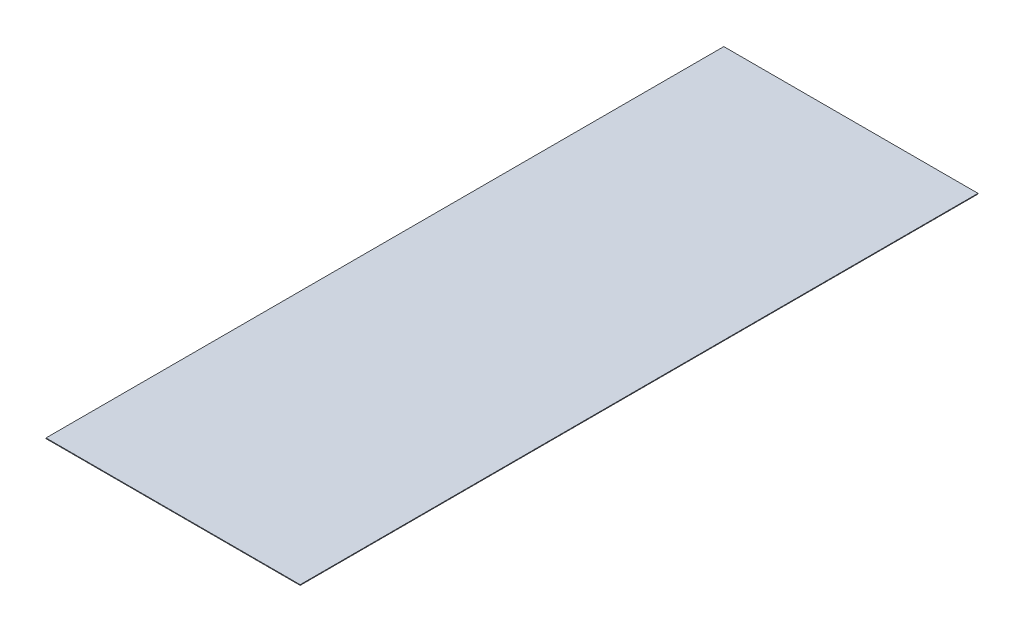
ISO-10303-21;
HEADER;
FILE_DESCRIPTION(('STEP AP214'),'2;1');
FILE_NAME('part.step','',(''),(''),'','','');
FILE_SCHEMA(('AUTOMOTIVE_DESIGN { 1 0 10303 214 1 1 1 1 }'));
ENDSEC;
DATA;
#1=APPLICATION_CONTEXT('core data for automotive mechanical design processes');
#2=APPLICATION_PROTOCOL_DEFINITION('international standard','automotive_design',2000,#1);
#3=PRODUCT_CONTEXT('',#1,'mechanical');
#4=PRODUCT('Part','Part','',(#3));
#5=PRODUCT_RELATED_PRODUCT_CATEGORY('part','',(#4));
#6=PRODUCT_DEFINITION_FORMATION('','',#4);
#7=PRODUCT_DEFINITION_CONTEXT('part definition',#1,'design');
#8=PRODUCT_DEFINITION('design','',#6,#7);
#9=PRODUCT_DEFINITION_SHAPE('','',#8);
#10=(LENGTH_UNIT() NAMED_UNIT(*) SI_UNIT(.MILLI.,.METRE.));
#11=(NAMED_UNIT(*) PLANE_ANGLE_UNIT() SI_UNIT($,.RADIAN.));
#12=(NAMED_UNIT(*) SI_UNIT($,.STERADIAN.) SOLID_ANGLE_UNIT());
#13=UNCERTAINTY_MEASURE_WITH_UNIT(LENGTH_MEASURE(1.E-05),#10,'distance_accuracy_value','');
#14=(GEOMETRIC_REPRESENTATION_CONTEXT(3) GLOBAL_UNCERTAINTY_ASSIGNED_CONTEXT((#13)) GLOBAL_UNIT_ASSIGNED_CONTEXT((#10,
#11,#12)) REPRESENTATION_CONTEXT('',''));
#15=CARTESIAN_POINT('',(0.,0.,0.));
#16=DIRECTION('',(0.,0.,1.));
#17=DIRECTION('',(1.,0.,0.));
#18=AXIS2_PLACEMENT_3D('',#15,#16,#17);
#19=CARTESIAN_POINT('',(457.2,2.3,1219.2));
#20=DIRECTION('',(-1.,0.,0.));
#21=DIRECTION('',(0.,0.,1.));
#22=AXIS2_PLACEMENT_3D('',#19,#20,#21);
#23=PLANE('',#22);
#24=DIRECTION('',(0.,0.,-1.));
#25=VECTOR('',#24,1.);
#26=CARTESIAN_POINT('',(457.2,0.,1219.2));
#27=LINE('',#26,#25);
#28=CARTESIAN_POINT('',(457.2,0.,1219.2));
#29=VERTEX_POINT('',#28);
#30=CARTESIAN_POINT('',(457.2,0.,-1219.2));
#31=VERTEX_POINT('',#30);
#32=EDGE_CURVE('E96',#29,#31,#27,.T.);
#33=ORIENTED_EDGE('',*,*,#32,.T.);
#34=DIRECTION('',(0.,-1.,0.));
#35=VECTOR('',#34,1.);
#36=CARTESIAN_POINT('',(457.2,2.3,-1219.2));
#37=LINE('',#36,#35);
#38=CARTESIAN_POINT('',(457.2,2.3,-1219.2));
#39=VERTEX_POINT('',#38);
#40=EDGE_CURVE('E11',#39,#31,#37,.T.);
#41=ORIENTED_EDGE('',*,*,#40,.F.);
#42=DIRECTION('',(0.,0.,-1.));
#43=VECTOR('',#42,1.);
#44=CARTESIAN_POINT('',(457.2,2.3,1219.2));
#45=LINE('',#44,#43);
#46=CARTESIAN_POINT('',(457.2,2.3,1219.2));
#47=VERTEX_POINT('',#46);
#48=EDGE_CURVE('E84',#47,#39,#45,.T.);
#49=ORIENTED_EDGE('',*,*,#48,.F.);
#50=DIRECTION('',(0.,-1.,0.));
#51=VECTOR('',#50,1.);
#52=CARTESIAN_POINT('',(457.2,2.3,1219.2));
#53=LINE('',#52,#51);
#54=EDGE_CURVE('E92',#47,#29,#53,.T.);
#55=ORIENTED_EDGE('',*,*,#54,.T.);
#56=EDGE_LOOP('',(#33,#41,#49,#55));
#57=FACE_BOUND('',#56,.T.);
#58=ADVANCED_FACE('F33',(#57),#23,.F.);
#59=CARTESIAN_POINT('',(-457.2,2.3,-1219.2));
#60=DIRECTION('',(0.,0.,1.));
#61=DIRECTION('',(1.,0.,0.));
#62=AXIS2_PLACEMENT_3D('',#59,#60,#61);
#63=PLANE('',#62);
#64=DIRECTION('',(-1.,0.,0.));
#65=VECTOR('',#64,1.);
#66=CARTESIAN_POINT('',(-457.2,0.,-1219.2));
#67=LINE('',#66,#65);
#68=CARTESIAN_POINT('',(-457.2,0.,-1219.2));
#69=VERTEX_POINT('',#68);
#70=EDGE_CURVE('E88',#31,#69,#67,.T.);
#71=ORIENTED_EDGE('',*,*,#70,.T.);
#72=DIRECTION('',(0.,-1.,0.));
#73=VECTOR('',#72,1.);
#74=CARTESIAN_POINT('',(-457.2,2.3,-1219.2));
#75=LINE('',#74,#73);
#76=CARTESIAN_POINT('',(-457.2,2.3,-1219.2));
#77=VERTEX_POINT('',#76);
#78=EDGE_CURVE('E41',#77,#69,#75,.T.);
#79=ORIENTED_EDGE('',*,*,#78,.F.);
#80=DIRECTION('',(-1.,0.,0.));
#81=VECTOR('',#80,1.);
#82=CARTESIAN_POINT('',(-457.2,2.3,-1219.2));
#83=LINE('',#82,#81);
#84=EDGE_CURVE('E79',#39,#77,#83,.T.);
#85=ORIENTED_EDGE('',*,*,#84,.F.);
#86=ORIENTED_EDGE('',*,*,#40,.T.);
#87=EDGE_LOOP('',(#71,#79,#85,#86));
#88=FACE_BOUND('',#87,.T.);
#89=ADVANCED_FACE('F87',(#88),#63,.F.);
#90=CARTESIAN_POINT('',(-457.2,2.3,1219.2));
#91=DIRECTION('',(1.,0.,0.));
#92=DIRECTION('',(0.,0.,-1.));
#93=AXIS2_PLACEMENT_3D('',#90,#91,#92);
#94=PLANE('',#93);
#95=DIRECTION('',(0.,0.,1.));
#96=VECTOR('',#95,1.);
#97=CARTESIAN_POINT('',(-457.2,0.,1219.2));
#98=LINE('',#97,#96);
#99=CARTESIAN_POINT('',(-457.2,0.,1219.2));
#100=VERTEX_POINT('',#99);
#101=EDGE_CURVE('E66',#69,#100,#98,.T.);
#102=ORIENTED_EDGE('',*,*,#101,.T.);
#103=DIRECTION('',(0.,-1.,0.));
#104=VECTOR('',#103,1.);
#105=CARTESIAN_POINT('',(-457.2,2.3,1219.2));
#106=LINE('',#105,#104);
#107=CARTESIAN_POINT('',(-457.2,2.3,1219.2));
#108=VERTEX_POINT('',#107);
#109=EDGE_CURVE('E89',#108,#100,#106,.T.);
#110=ORIENTED_EDGE('',*,*,#109,.F.);
#111=DIRECTION('',(0.,0.,1.));
#112=VECTOR('',#111,1.);
#113=CARTESIAN_POINT('',(-457.2,2.3,1219.2));
#114=LINE('',#113,#112);
#115=EDGE_CURVE('E82',#77,#108,#114,.T.);
#116=ORIENTED_EDGE('',*,*,#115,.F.);
#117=ORIENTED_EDGE('',*,*,#78,.T.);
#118=EDGE_LOOP('',(#102,#110,#116,#117));
#119=FACE_BOUND('',#118,.T.);
#120=ADVANCED_FACE('F90',(#119),#94,.F.);
#121=CARTESIAN_POINT('',(-457.2,2.3,1219.2));
#122=DIRECTION('',(0.,0.,-1.));
#123=DIRECTION('',(-1.,0.,0.));
#124=AXIS2_PLACEMENT_3D('',#121,#122,#123);
#125=PLANE('',#124);
#126=DIRECTION('',(1.,0.,0.));
#127=VECTOR('',#126,1.);
#128=CARTESIAN_POINT('',(-457.2,0.,1219.2));
#129=LINE('',#128,#127);
#130=EDGE_CURVE('E72',#100,#29,#129,.T.);
#131=ORIENTED_EDGE('',*,*,#130,.T.);
#132=ORIENTED_EDGE('',*,*,#54,.F.);
#133=DIRECTION('',(1.,0.,0.));
#134=VECTOR('',#133,1.);
#135=CARTESIAN_POINT('',(-457.2,2.3,1219.2));
#136=LINE('',#135,#134);
#137=EDGE_CURVE('E49',#108,#47,#136,.T.);
#138=ORIENTED_EDGE('',*,*,#137,.F.);
#139=ORIENTED_EDGE('',*,*,#109,.T.);
#140=EDGE_LOOP('',(#131,#132,#138,#139));
#141=FACE_BOUND('',#140,.T.);
#142=ADVANCED_FACE('F103',(#141),#125,.F.);
#143=CARTESIAN_POINT('',(0.,2.3,0.));
#144=DIRECTION('',(0.,-1.,0.));
#145=DIRECTION('',(0.,0.,-1.));
#146=AXIS2_PLACEMENT_3D('',#143,#144,#145);
#147=PLANE('',#146);
#148=ORIENTED_EDGE('',*,*,#48,.T.);
#149=ORIENTED_EDGE('',*,*,#84,.T.);
#150=ORIENTED_EDGE('',*,*,#115,.T.);
#151=ORIENTED_EDGE('',*,*,#137,.T.);
#152=EDGE_LOOP('',(#148,#149,#150,#151));
#153=FACE_BOUND('',#152,.T.);
#154=ADVANCED_FACE('F80',(#153),#147,.F.);
#155=CARTESIAN_POINT('',(0.,0.,0.));
#156=DIRECTION('',(0.,-1.,0.));
#157=DIRECTION('',(0.,0.,-1.));
#158=AXIS2_PLACEMENT_3D('',#155,#156,#157);
#159=PLANE('',#158);
#160=ORIENTED_EDGE('',*,*,#32,.F.);
#161=ORIENTED_EDGE('',*,*,#130,.F.);
#162=ORIENTED_EDGE('',*,*,#101,.F.);
#163=ORIENTED_EDGE('',*,*,#70,.F.);
#164=EDGE_LOOP('',(#160,#161,#162,#163));
#165=FACE_BOUND('',#164,.T.);
#166=ADVANCED_FACE('F106',(#165),#159,.T.);
#167=CLOSED_SHELL('',(#58,#89,#120,#142,#154,#166));
#168=MANIFOLD_SOLID_BREP('B2',#167);
#169=ADVANCED_BREP_SHAPE_REPRESENTATION('',(#18,#168),#14);
#170=SHAPE_DEFINITION_REPRESENTATION(#9,#169);
ENDSEC;
END-ISO-10303-21;
